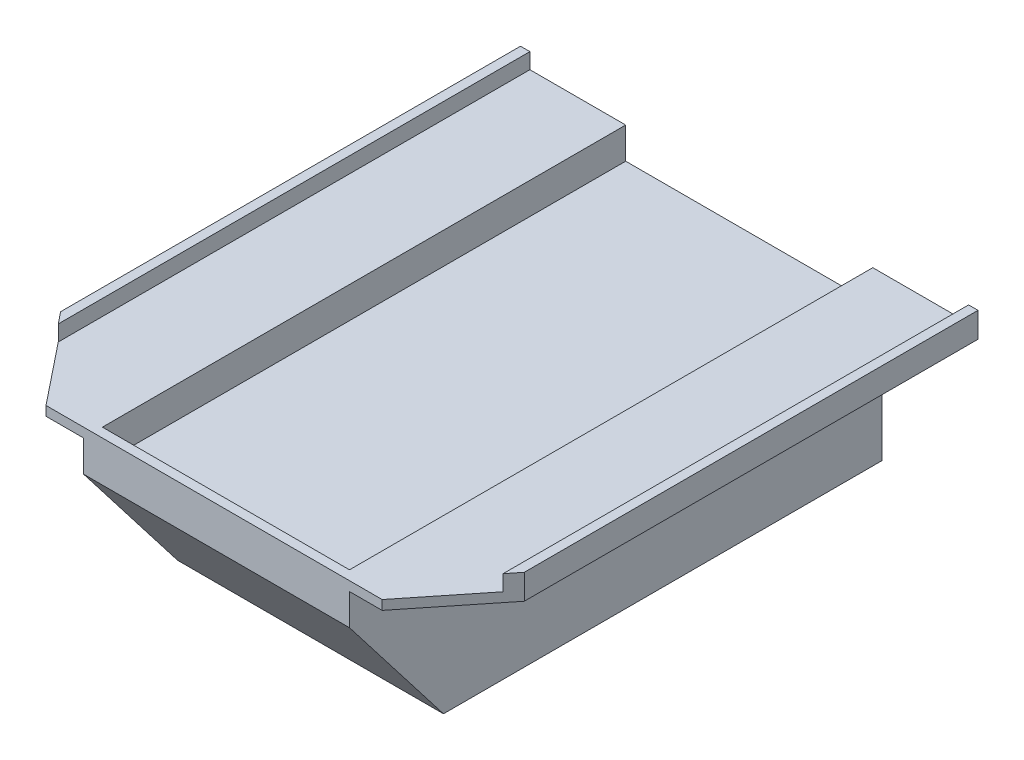
ISO-10303-21;
HEADER;
FILE_DESCRIPTION(('STEP AP214'),'2;1');
FILE_NAME('part.step','',(''),(''),'','','');
FILE_SCHEMA(('AUTOMOTIVE_DESIGN { 1 0 10303 214 1 1 1 1 }'));
ENDSEC;
DATA;
#1=APPLICATION_CONTEXT('core data for automotive mechanical design processes');
#2=APPLICATION_PROTOCOL_DEFINITION('international standard','automotive_design',2000,#1);
#3=PRODUCT_CONTEXT('',#1,'mechanical');
#4=PRODUCT('Part','Part','',(#3));
#5=PRODUCT_RELATED_PRODUCT_CATEGORY('part','',(#4));
#6=PRODUCT_DEFINITION_FORMATION('','',#4);
#7=PRODUCT_DEFINITION_CONTEXT('part definition',#1,'design');
#8=PRODUCT_DEFINITION('design','',#6,#7);
#9=PRODUCT_DEFINITION_SHAPE('','',#8);
#10=(LENGTH_UNIT() NAMED_UNIT(*) SI_UNIT(.MILLI.,.METRE.));
#11=(NAMED_UNIT(*) PLANE_ANGLE_UNIT() SI_UNIT($,.RADIAN.));
#12=(NAMED_UNIT(*) SI_UNIT($,.STERADIAN.) SOLID_ANGLE_UNIT());
#13=UNCERTAINTY_MEASURE_WITH_UNIT(LENGTH_MEASURE(1.E-05),#10,'distance_accuracy_value','');
#14=(GEOMETRIC_REPRESENTATION_CONTEXT(3) GLOBAL_UNCERTAINTY_ASSIGNED_CONTEXT((#13)) GLOBAL_UNIT_ASSIGNED_CONTEXT((#10,
#11,#12)) REPRESENTATION_CONTEXT('',''));
#15=CARTESIAN_POINT('',(0.,0.,0.));
#16=DIRECTION('',(0.,0.,1.));
#17=DIRECTION('',(1.,0.,0.));
#18=AXIS2_PLACEMENT_3D('',#15,#16,#17);
#19=CARTESIAN_POINT('',(-39.425,13.,170.));
#20=DIRECTION('',(-1.,0.,0.));
#21=DIRECTION('',(0.,0.,1.));
#22=AXIS2_PLACEMENT_3D('',#19,#20,#21);
#23=PLANE('',#22);
#24=DIRECTION('',(0.,1.,0.));
#25=VECTOR('',#24,1.);
#26=CARTESIAN_POINT('',(-39.425,13.,167.));
#27=LINE('',#26,#25);
#28=CARTESIAN_POINT('',(-39.425,2.99999999999999,167.));
#29=VERTEX_POINT('',#28);
#30=CARTESIAN_POINT('',(-39.425,13.,167.));
#31=VERTEX_POINT('',#30);
#32=EDGE_CURVE('E199',#29,#31,#27,.T.);
#33=ORIENTED_EDGE('',*,*,#32,.F.);
#34=DIRECTION('',(0.,0.,-1.));
#35=VECTOR('',#34,1.);
#36=CARTESIAN_POINT('',(-39.425,2.99999999999999,170.));
#37=LINE('',#36,#35);
#38=CARTESIAN_POINT('',(-39.425,2.99999999999999,0.));
#39=VERTEX_POINT('',#38);
#40=EDGE_CURVE('E219',#29,#39,#37,.T.);
#41=ORIENTED_EDGE('',*,*,#40,.T.);
#42=DIRECTION('',(0.,1.,0.));
#43=VECTOR('',#42,1.);
#44=CARTESIAN_POINT('',(-39.425,13.,0.));
#45=LINE('',#44,#43);
#46=CARTESIAN_POINT('',(-39.425,13.,0.));
#47=VERTEX_POINT('',#46);
#48=EDGE_CURVE('E282',#39,#47,#45,.T.);
#49=ORIENTED_EDGE('',*,*,#48,.T.);
#50=DIRECTION('',(0.,0.,-1.));
#51=VECTOR('',#50,1.);
#52=CARTESIAN_POINT('',(-39.425,13.,170.));
#53=LINE('',#52,#51);
#54=EDGE_CURVE('E252',#31,#47,#53,.T.);
#55=ORIENTED_EDGE('',*,*,#54,.F.);
#56=EDGE_LOOP('',(#33,#41,#49,#55));
#57=FACE_BOUND('',#56,.T.);
#58=ADVANCED_FACE('F33',(#57),#23,.F.);
#59=CARTESIAN_POINT('',(39.425,13.,170.));
#60=DIRECTION('',(1.,0.,0.));
#61=DIRECTION('',(0.,0.,-1.));
#62=AXIS2_PLACEMENT_3D('',#59,#60,#61);
#63=PLANE('',#62);
#64=DIRECTION('',(0.,-1.,0.));
#65=VECTOR('',#64,1.);
#66=CARTESIAN_POINT('',(39.425,13.,167.));
#67=LINE('',#66,#65);
#68=CARTESIAN_POINT('',(39.425,13.,167.));
#69=VERTEX_POINT('',#68);
#70=CARTESIAN_POINT('',(39.425,2.99999999999999,167.));
#71=VERTEX_POINT('',#70);
#72=EDGE_CURVE('E196',#69,#71,#67,.T.);
#73=ORIENTED_EDGE('',*,*,#72,.F.);
#74=DIRECTION('',(0.,0.,-1.));
#75=VECTOR('',#74,1.);
#76=CARTESIAN_POINT('',(39.425,13.,170.));
#77=LINE('',#76,#75);
#78=CARTESIAN_POINT('',(39.425,13.,0.));
#79=VERTEX_POINT('',#78);
#80=EDGE_CURVE('E207',#69,#79,#77,.T.);
#81=ORIENTED_EDGE('',*,*,#80,.T.);
#82=DIRECTION('',(0.,-1.,0.));
#83=VECTOR('',#82,1.);
#84=CARTESIAN_POINT('',(39.425,13.,0.));
#85=LINE('',#84,#83);
#86=CARTESIAN_POINT('',(39.425,2.99999999999999,0.));
#87=VERTEX_POINT('',#86);
#88=EDGE_CURVE('E334',#79,#87,#85,.T.);
#89=ORIENTED_EDGE('',*,*,#88,.T.);
#90=DIRECTION('',(0.,0.,-1.));
#91=VECTOR('',#90,1.);
#92=CARTESIAN_POINT('',(39.425,2.99999999999999,170.));
#93=LINE('',#92,#91);
#94=EDGE_CURVE('E209',#71,#87,#93,.T.);
#95=ORIENTED_EDGE('',*,*,#94,.F.);
#96=EDGE_LOOP('',(#73,#81,#89,#95));
#97=FACE_BOUND('',#96,.T.);
#98=ADVANCED_FACE('F205',(#97),#63,.F.);
#99=CARTESIAN_POINT('',(-39.425,2.99999999999999,170.));
#100=DIRECTION('',(0.,-1.,0.));
#101=DIRECTION('',(0.,0.,-1.));
#102=AXIS2_PLACEMENT_3D('',#99,#100,#101);
#103=PLANE('',#102);
#104=DIRECTION('',(-1.,0.,0.));
#105=VECTOR('',#104,1.);
#106=CARTESIAN_POINT('',(-39.425,2.99999999999999,167.));
#107=LINE('',#106,#105);
#108=EDGE_CURVE('E11',#71,#29,#107,.T.);
#109=ORIENTED_EDGE('',*,*,#108,.F.);
#110=ORIENTED_EDGE('',*,*,#94,.T.);
#111=DIRECTION('',(-1.,0.,0.));
#112=VECTOR('',#111,1.);
#113=CARTESIAN_POINT('',(-39.425,2.99999999999999,0.));
#114=LINE('',#113,#112);
#115=EDGE_CURVE('E336',#87,#39,#114,.T.);
#116=ORIENTED_EDGE('',*,*,#115,.T.);
#117=ORIENTED_EDGE('',*,*,#40,.F.);
#118=EDGE_LOOP('',(#109,#110,#116,#117));
#119=FACE_BOUND('',#118,.T.);
#120=ADVANCED_FACE('F454',(#119),#103,.F.);
#121=CARTESIAN_POINT('',(-39.425,0.,170.));
#122=DIRECTION('',(0.,1.,0.));
#123=DIRECTION('',(0.,0.,1.));
#124=AXIS2_PLACEMENT_3D('',#121,#122,#123);
#125=PLANE('',#124);
#126=DIRECTION('',(1.,0.,0.));
#127=VECTOR('',#126,1.);
#128=CARTESIAN_POINT('',(-39.425,0.,166.207838773471));
#129=LINE('',#128,#127);
#130=CARTESIAN_POINT('',(-39.425,0.,166.207838773471));
#131=VERTEX_POINT('',#130);
#132=CARTESIAN_POINT('',(39.425,0.,166.207838773471));
#133=VERTEX_POINT('',#132);
#134=EDGE_CURVE('E407',#131,#133,#129,.T.);
#135=ORIENTED_EDGE('',*,*,#134,.F.);
#136=DIRECTION('',(0.,0.,-1.));
#137=VECTOR('',#136,1.);
#138=CARTESIAN_POINT('',(-39.425,0.,170.));
#139=LINE('',#138,#137);
#140=CARTESIAN_POINT('',(-39.425,0.,0.));
#141=VERTEX_POINT('',#140);
#142=EDGE_CURVE('E236',#131,#141,#139,.T.);
#143=ORIENTED_EDGE('',*,*,#142,.T.);
#144=DIRECTION('',(1.,0.,0.));
#145=VECTOR('',#144,1.);
#146=CARTESIAN_POINT('',(-39.425,0.,0.));
#147=LINE('',#146,#145);
#148=CARTESIAN_POINT('',(39.425,0.,0.));
#149=VERTEX_POINT('',#148);
#150=EDGE_CURVE('E310',#141,#149,#147,.T.);
#151=ORIENTED_EDGE('',*,*,#150,.T.);
#152=DIRECTION('',(0.,0.,-1.));
#153=VECTOR('',#152,1.);
#154=CARTESIAN_POINT('',(39.425,0.,170.));
#155=LINE('',#154,#153);
#156=EDGE_CURVE('E234',#133,#149,#155,.T.);
#157=ORIENTED_EDGE('',*,*,#156,.F.);
#158=EDGE_LOOP('',(#135,#143,#151,#157));
#159=FACE_BOUND('',#158,.T.);
#160=ADVANCED_FACE('F434',(#159),#125,.F.);
#161=CARTESIAN_POINT('',(-70.,18.,170.));
#162=DIRECTION('',(-1.,0.,0.));
#163=DIRECTION('',(0.,0.,1.));
#164=AXIS2_PLACEMENT_3D('',#161,#162,#163);
#165=PLANE('',#164);
#166=DIRECTION('',(0.,0.,-1.));
#167=VECTOR('',#166,1.);
#168=CARTESIAN_POINT('',(-70.,18.,170.));
#169=LINE('',#168,#167);
#170=CARTESIAN_POINT('',(-70.,18.,150.507859600993));
#171=VERTEX_POINT('',#170);
#172=CARTESIAN_POINT('',(-70.,18.,0.));
#173=VERTEX_POINT('',#172);
#174=EDGE_CURVE('E248',#171,#173,#169,.T.);
#175=ORIENTED_EDGE('',*,*,#174,.F.);
#176=DIRECTION('',(0.,-1.,0.));
#177=VECTOR('',#176,1.);
#178=CARTESIAN_POINT('',(-70.,18.,150.507859600993));
#179=LINE('',#178,#177);
#180=CARTESIAN_POINT('',(-70.,13.,150.507859600993));
#181=VERTEX_POINT('',#180);
#182=EDGE_CURVE('E389',#171,#181,#179,.T.);
#183=ORIENTED_EDGE('',*,*,#182,.T.);
#184=DIRECTION('',(0.,0.,-1.));
#185=VECTOR('',#184,1.);
#186=CARTESIAN_POINT('',(-70.,13.,170.));
#187=LINE('',#186,#185);
#188=CARTESIAN_POINT('',(-70.,13.,0.));
#189=VERTEX_POINT('',#188);
#190=EDGE_CURVE('E250',#181,#189,#187,.T.);
#191=ORIENTED_EDGE('',*,*,#190,.T.);
#192=DIRECTION('',(0.,1.,0.));
#193=VECTOR('',#192,1.);
#194=CARTESIAN_POINT('',(-70.,18.,0.));
#195=LINE('',#194,#193);
#196=EDGE_CURVE('E289',#189,#173,#195,.T.);
#197=ORIENTED_EDGE('',*,*,#196,.T.);
#198=EDGE_LOOP('',(#175,#183,#191,#197));
#199=FACE_BOUND('',#198,.T.);
#200=ADVANCED_FACE('F462',(#199),#165,.F.);
#201=CARTESIAN_POINT('',(-73.,18.,170.));
#202=DIRECTION('',(0.,-1.,0.));
#203=DIRECTION('',(0.,0.,-1.));
#204=AXIS2_PLACEMENT_3D('',#201,#202,#203);
#205=PLANE('',#204);
#206=DIRECTION('',(0.,0.,-1.));
#207=VECTOR('',#206,1.);
#208=CARTESIAN_POINT('',(-73.,18.,170.));
#209=LINE('',#208,#207);
#210=CARTESIAN_POINT('',(-73.,18.,146.75413566852));
#211=VERTEX_POINT('',#210);
#212=CARTESIAN_POINT('',(-73.,18.,0.));
#213=VERTEX_POINT('',#212);
#214=EDGE_CURVE('E246',#211,#213,#209,.T.);
#215=ORIENTED_EDGE('',*,*,#214,.F.);
#216=DIRECTION('',(-0.624316939531645,0.,-0.781171145789347));
#217=VECTOR('',#216,1.);
#218=CARTESIAN_POINT('',(-54.4217576334917,18.,170.));
#219=LINE('',#218,#217);
#220=EDGE_CURVE('E270',#171,#211,#219,.T.);
#221=ORIENTED_EDGE('',*,*,#220,.F.);
#222=ORIENTED_EDGE('',*,*,#174,.T.);
#223=DIRECTION('',(-1.,0.,0.));
#224=VECTOR('',#223,1.);
#225=CARTESIAN_POINT('',(-73.,18.,0.));
#226=LINE('',#225,#224);
#227=EDGE_CURVE('E292',#173,#213,#226,.T.);
#228=ORIENTED_EDGE('',*,*,#227,.T.);
#229=EDGE_LOOP('',(#215,#221,#222,#228));
#230=FACE_BOUND('',#229,.T.);
#231=ADVANCED_FACE('F467',(#230),#205,.F.);
#232=CARTESIAN_POINT('',(-73.,9.99999999999999,170.));
#233=DIRECTION('',(1.,0.,0.));
#234=DIRECTION('',(0.,1.,0.));
#235=AXIS2_PLACEMENT_3D('',#232,#233,#234);
#236=PLANE('',#235);
#237=DIRECTION('',(0.,0.,-1.));
#238=VECTOR('',#237,1.);
#239=CARTESIAN_POINT('',(-73.,9.99999999999999,170.));
#240=LINE('',#239,#238);
#241=CARTESIAN_POINT('',(-73.,9.99999999999999,146.75413566852));
#242=VERTEX_POINT('',#241);
#243=CARTESIAN_POINT('',(-73.,9.99999999999999,0.));
#244=VERTEX_POINT('',#243);
#245=EDGE_CURVE('E244',#242,#244,#240,.T.);
#246=ORIENTED_EDGE('',*,*,#245,.F.);
#247=DIRECTION('',(0.,1.,0.));
#248=VECTOR('',#247,1.);
#249=CARTESIAN_POINT('',(-73.,-38.8,146.75413566852));
#250=LINE('',#249,#248);
#251=EDGE_CURVE('E385',#242,#211,#250,.T.);
#252=ORIENTED_EDGE('',*,*,#251,.T.);
#253=ORIENTED_EDGE('',*,*,#214,.T.);
#254=DIRECTION('',(0.,-1.,0.));
#255=VECTOR('',#254,1.);
#256=CARTESIAN_POINT('',(-73.,9.99999999999999,0.));
#257=LINE('',#256,#255);
#258=EDGE_CURVE('E295',#213,#244,#257,.T.);
#259=ORIENTED_EDGE('',*,*,#258,.T.);
#260=EDGE_LOOP('',(#246,#252,#253,#259));
#261=FACE_BOUND('',#260,.T.);
#262=ADVANCED_FACE('F471',(#261),#236,.F.);
#263=CARTESIAN_POINT('',(-42.425,9.99999999999999,170.));
#264=DIRECTION('',(0.,1.,0.));
#265=DIRECTION('',(-1.,0.,0.));
#266=AXIS2_PLACEMENT_3D('',#263,#264,#265);
#267=PLANE('',#266);
#268=DIRECTION('',(1.,0.,0.));
#269=VECTOR('',#268,1.);
#270=CARTESIAN_POINT('',(-42.425,9.99999999999999,170.));
#271=LINE('',#270,#269);
#272=CARTESIAN_POINT('',(-54.4217576334917,9.99999999999999,170.));
#273=VERTEX_POINT('',#272);
#274=CARTESIAN_POINT('',(-42.425,9.99999999999999,170.));
#275=VERTEX_POINT('',#274);
#276=EDGE_CURVE('E342',#273,#275,#271,.T.);
#277=ORIENTED_EDGE('',*,*,#276,.F.);
#278=DIRECTION('',(-0.624316939531645,0.,-0.781171145789347));
#279=VECTOR('',#278,1.);
#280=CARTESIAN_POINT('',(-49.7457617241724,9.99999999999999,175.850799250985));
#281=LINE('',#280,#279);
#282=EDGE_CURVE('E55',#273,#242,#281,.T.);
#283=ORIENTED_EDGE('',*,*,#282,.T.);
#284=ORIENTED_EDGE('',*,*,#245,.T.);
#285=DIRECTION('',(1.,0.,0.));
#286=VECTOR('',#285,1.);
#287=CARTESIAN_POINT('',(-42.425,9.99999999999999,0.));
#288=LINE('',#287,#286);
#289=CARTESIAN_POINT('',(-42.425,9.99999999999999,0.));
#290=VERTEX_POINT('',#289);
#291=EDGE_CURVE('E298',#244,#290,#288,.T.);
#292=ORIENTED_EDGE('',*,*,#291,.T.);
#293=DIRECTION('',(0.,0.,-1.));
#294=VECTOR('',#293,1.);
#295=CARTESIAN_POINT('',(-42.425,9.99999999999999,170.));
#296=LINE('',#295,#294);
#297=EDGE_CURVE('E242',#275,#290,#296,.T.);
#298=ORIENTED_EDGE('',*,*,#297,.F.);
#299=EDGE_LOOP('',(#277,#283,#284,#292,#298));
#300=FACE_BOUND('',#299,.T.);
#301=ADVANCED_FACE('F475',(#300),#267,.F.);
#302=CARTESIAN_POINT('',(-42.425,9.99999999999999,170.));
#303=DIRECTION('',(1.,0.,0.));
#304=DIRECTION('',(0.,1.,0.));
#305=AXIS2_PLACEMENT_3D('',#302,#303,#304);
#306=PLANE('',#305);
#307=DIRECTION('',(0.,0.791105604638577,0.611679591215394));
#308=VECTOR('',#307,1.);
#309=CARTESIAN_POINT('',(-42.425,6.25848077690568,174.839031528535));
#310=LINE('',#309,#308);
#311=CARTESIAN_POINT('',(-42.425,-38.8,140.));
#312=VERTEX_POINT('',#311);
#313=CARTESIAN_POINT('',(-42.425,0.,170.));
#314=VERTEX_POINT('',#313);
#315=EDGE_CURVE('E286',#312,#314,#310,.T.);
#316=ORIENTED_EDGE('',*,*,#315,.T.);
#317=DIRECTION('',(0.,-1.,0.));
#318=VECTOR('',#317,1.);
#319=CARTESIAN_POINT('',(-42.425,9.99999999999999,170.));
#320=LINE('',#319,#318);
#321=EDGE_CURVE('E344',#275,#314,#320,.T.);
#322=ORIENTED_EDGE('',*,*,#321,.F.);
#323=ORIENTED_EDGE('',*,*,#297,.T.);
#324=DIRECTION('',(0.,-1.,0.));
#325=VECTOR('',#324,1.);
#326=CARTESIAN_POINT('',(-42.425,9.99999999999999,0.));
#327=LINE('',#326,#325);
#328=CARTESIAN_POINT('',(-42.425,-38.8,0.));
#329=VERTEX_POINT('',#328);
#330=EDGE_CURVE('E301',#290,#329,#327,.T.);
#331=ORIENTED_EDGE('',*,*,#330,.T.);
#332=DIRECTION('',(0.,0.,-1.));
#333=VECTOR('',#332,1.);
#334=CARTESIAN_POINT('',(-42.425,-38.8,170.));
#335=LINE('',#334,#333);
#336=EDGE_CURVE('E240',#312,#329,#335,.T.);
#337=ORIENTED_EDGE('',*,*,#336,.F.);
#338=EDGE_LOOP('',(#316,#322,#323,#331,#337));
#339=FACE_BOUND('',#338,.T.);
#340=ADVANCED_FACE('F479',(#339),#306,.F.);
#341=CARTESIAN_POINT('',(-42.425,-38.8,170.));
#342=DIRECTION('',(0.,1.,0.));
#343=DIRECTION('',(0.,0.,1.));
#344=AXIS2_PLACEMENT_3D('',#341,#342,#343);
#345=PLANE('',#344);
#346=DIRECTION('',(0.,0.,-1.));
#347=VECTOR('',#346,1.);
#348=CARTESIAN_POINT('',(-39.425,-38.8,170.));
#349=LINE('',#348,#347);
#350=CARTESIAN_POINT('',(-39.425,-38.8,140.));
#351=VERTEX_POINT('',#350);
#352=CARTESIAN_POINT('',(-39.425,-38.8,0.));
#353=VERTEX_POINT('',#352);
#354=EDGE_CURVE('E238',#351,#353,#349,.T.);
#355=ORIENTED_EDGE('',*,*,#354,.F.);
#356=DIRECTION('',(1.,0.,0.));
#357=VECTOR('',#356,1.);
#358=CARTESIAN_POINT('',(-73.,-38.8,140.));
#359=LINE('',#358,#357);
#360=EDGE_CURVE('E362',#312,#351,#359,.T.);
#361=ORIENTED_EDGE('',*,*,#360,.F.);
#362=ORIENTED_EDGE('',*,*,#336,.T.);
#363=DIRECTION('',(1.,0.,0.));
#364=VECTOR('',#363,1.);
#365=CARTESIAN_POINT('',(-42.425,-38.8,0.));
#366=LINE('',#365,#364);
#367=EDGE_CURVE('E304',#329,#353,#366,.T.);
#368=ORIENTED_EDGE('',*,*,#367,.T.);
#369=EDGE_LOOP('',(#355,#361,#362,#368));
#370=FACE_BOUND('',#369,.T.);
#371=ADVANCED_FACE('F416',(#370),#345,.F.);
#372=CARTESIAN_POINT('',(-39.425,-38.8,170.));
#373=DIRECTION('',(-1.,0.,0.));
#374=DIRECTION('',(0.,0.,1.));
#375=AXIS2_PLACEMENT_3D('',#372,#373,#374);
#376=PLANE('',#375);
#377=DIRECTION('',(0.,-0.791105604638577,-0.611679591215394));
#378=VECTOR('',#377,1.);
#379=CARTESIAN_POINT('',(-39.425,1.8350387736462,167.626683186084));
#380=LINE('',#379,#378);
#381=CARTESIAN_POINT('',(-39.425,-36.9649612263538,137.626683186084));
#382=VERTEX_POINT('',#381);
#383=EDGE_CURVE('E395',#131,#382,#380,.T.);
#384=ORIENTED_EDGE('',*,*,#383,.T.);
#385=DIRECTION('',(0.,-0.611679591215394,0.791105604638577));
#386=VECTOR('',#385,1.);
#387=CARTESIAN_POINT('',(-39.425,-36.9649612263538,137.626683186084));
#388=LINE('',#387,#386);
#389=EDGE_CURVE('E402',#382,#351,#388,.T.);
#390=ORIENTED_EDGE('',*,*,#389,.T.);
#391=ORIENTED_EDGE('',*,*,#354,.T.);
#392=DIRECTION('',(0.,1.,0.));
#393=VECTOR('',#392,1.);
#394=CARTESIAN_POINT('',(-39.425,-38.8,0.));
#395=LINE('',#394,#393);
#396=EDGE_CURVE('E307',#353,#141,#395,.T.);
#397=ORIENTED_EDGE('',*,*,#396,.T.);
#398=ORIENTED_EDGE('',*,*,#142,.F.);
#399=EDGE_LOOP('',(#384,#390,#391,#397,#398));
#400=FACE_BOUND('',#399,.T.);
#401=ADVANCED_FACE('F435',(#400),#376,.F.);
#402=CARTESIAN_POINT('',(39.425,-38.8,170.));
#403=DIRECTION('',(1.,0.,0.));
#404=DIRECTION('',(0.,0.,-1.));
#405=AXIS2_PLACEMENT_3D('',#402,#403,#404);
#406=PLANE('',#405);
#407=DIRECTION('',(0.,0.,-1.));
#408=VECTOR('',#407,1.);
#409=CARTESIAN_POINT('',(39.425,-38.8,170.));
#410=LINE('',#409,#408);
#411=CARTESIAN_POINT('',(39.425,-38.8,140.));
#412=VERTEX_POINT('',#411);
#413=CARTESIAN_POINT('',(39.425,-38.8,0.));
#414=VERTEX_POINT('',#413);
#415=EDGE_CURVE('E232',#412,#414,#410,.T.);
#416=ORIENTED_EDGE('',*,*,#415,.F.);
#417=DIRECTION('',(0.,-0.611679591215394,0.791105604638577));
#418=VECTOR('',#417,1.);
#419=CARTESIAN_POINT('',(39.425,-36.9649612263538,137.626683186084));
#420=LINE('',#419,#418);
#421=CARTESIAN_POINT('',(39.425,-36.9649612263538,137.626683186084));
#422=VERTEX_POINT('',#421);
#423=EDGE_CURVE('E404',#422,#412,#420,.T.);
#424=ORIENTED_EDGE('',*,*,#423,.F.);
#425=DIRECTION('',(0.,0.791105604638577,0.611679591215394));
#426=VECTOR('',#425,1.);
#427=CARTESIAN_POINT('',(39.425,1.8350387736462,167.626683186084));
#428=LINE('',#427,#426);
#429=EDGE_CURVE('E400',#422,#133,#428,.T.);
#430=ORIENTED_EDGE('',*,*,#429,.T.);
#431=ORIENTED_EDGE('',*,*,#156,.T.);
#432=DIRECTION('',(0.,-1.,0.));
#433=VECTOR('',#432,1.);
#434=CARTESIAN_POINT('',(39.425,-38.8,0.));
#435=LINE('',#434,#433);
#436=EDGE_CURVE('E313',#149,#414,#435,.T.);
#437=ORIENTED_EDGE('',*,*,#436,.T.);
#438=EDGE_LOOP('',(#416,#424,#430,#431,#437));
#439=FACE_BOUND('',#438,.T.);
#440=ADVANCED_FACE('F427',(#439),#406,.F.);
#441=CARTESIAN_POINT('',(42.425,-38.8,170.));
#442=DIRECTION('',(0.,1.,0.));
#443=DIRECTION('',(0.,0.,1.));
#444=AXIS2_PLACEMENT_3D('',#441,#442,#443);
#445=PLANE('',#444);
#446=DIRECTION('',(0.,0.,-1.));
#447=VECTOR('',#446,1.);
#448=CARTESIAN_POINT('',(42.425,-38.8,170.));
#449=LINE('',#448,#447);
#450=CARTESIAN_POINT('',(42.425,-38.8,140.));
#451=VERTEX_POINT('',#450);
#452=CARTESIAN_POINT('',(42.425,-38.8,0.));
#453=VERTEX_POINT('',#452);
#454=EDGE_CURVE('E230',#451,#453,#449,.T.);
#455=ORIENTED_EDGE('',*,*,#454,.F.);
#456=EDGE_CURVE('E359',#412,#451,#359,.T.);
#457=ORIENTED_EDGE('',*,*,#456,.F.);
#458=ORIENTED_EDGE('',*,*,#415,.T.);
#459=DIRECTION('',(1.,0.,0.));
#460=VECTOR('',#459,1.);
#461=CARTESIAN_POINT('',(42.425,-38.8,0.));
#462=LINE('',#461,#460);
#463=EDGE_CURVE('E316',#414,#453,#462,.T.);
#464=ORIENTED_EDGE('',*,*,#463,.T.);
#465=EDGE_LOOP('',(#455,#457,#458,#464));
#466=FACE_BOUND('',#465,.T.);
#467=ADVANCED_FACE('F440',(#466),#445,.F.);
#468=CARTESIAN_POINT('',(42.425,9.99999999999999,170.));
#469=DIRECTION('',(-1.,0.,0.));
#470=DIRECTION('',(0.,-1.,0.));
#471=AXIS2_PLACEMENT_3D('',#468,#469,#470);
#472=PLANE('',#471);
#473=DIRECTION('',(0.,1.,0.));
#474=VECTOR('',#473,1.);
#475=CARTESIAN_POINT('',(42.425,9.99999999999999,170.));
#476=LINE('',#475,#474);
#477=CARTESIAN_POINT('',(42.425,0.,170.));
#478=VERTEX_POINT('',#477);
#479=CARTESIAN_POINT('',(42.425,9.99999999999999,170.));
#480=VERTEX_POINT('',#479);
#481=EDGE_CURVE('E275',#478,#480,#476,.T.);
#482=ORIENTED_EDGE('',*,*,#481,.F.);
#483=DIRECTION('',(0.,-0.791105604638577,-0.611679591215394));
#484=VECTOR('',#483,1.);
#485=CARTESIAN_POINT('',(42.425,6.25848077690568,174.839031528535));
#486=LINE('',#485,#484);
#487=EDGE_CURVE('E355',#478,#451,#486,.T.);
#488=ORIENTED_EDGE('',*,*,#487,.T.);
#489=ORIENTED_EDGE('',*,*,#454,.T.);
#490=DIRECTION('',(0.,1.,0.));
#491=VECTOR('',#490,1.);
#492=CARTESIAN_POINT('',(42.425,9.99999999999999,0.));
#493=LINE('',#492,#491);
#494=CARTESIAN_POINT('',(42.425,9.99999999999999,0.));
#495=VERTEX_POINT('',#494);
#496=EDGE_CURVE('E319',#453,#495,#493,.T.);
#497=ORIENTED_EDGE('',*,*,#496,.T.);
#498=DIRECTION('',(0.,0.,-1.));
#499=VECTOR('',#498,1.);
#500=CARTESIAN_POINT('',(42.425,9.99999999999999,170.));
#501=LINE('',#500,#499);
#502=EDGE_CURVE('E228',#480,#495,#501,.T.);
#503=ORIENTED_EDGE('',*,*,#502,.F.);
#504=EDGE_LOOP('',(#482,#488,#489,#497,#503));
#505=FACE_BOUND('',#504,.T.);
#506=ADVANCED_FACE('F363',(#505),#472,.F.);
#507=CARTESIAN_POINT('',(42.425,9.99999999999999,170.));
#508=DIRECTION('',(0.,1.,0.));
#509=DIRECTION('',(-1.,0.,0.));
#510=AXIS2_PLACEMENT_3D('',#507,#508,#509);
#511=PLANE('',#510);
#512=DIRECTION('',(0.,0.,-1.));
#513=VECTOR('',#512,1.);
#514=CARTESIAN_POINT('',(73.,9.99999999999999,170.));
#515=LINE('',#514,#513);
#516=CARTESIAN_POINT('',(73.,9.99999999999999,144.8));
#517=VERTEX_POINT('',#516);
#518=CARTESIAN_POINT('',(73.,9.99999999999999,0.));
#519=VERTEX_POINT('',#518);
#520=EDGE_CURVE('E226',#517,#519,#515,.T.);
#521=ORIENTED_EDGE('',*,*,#520,.F.);
#522=DIRECTION('',(-0.624316939531645,0.,0.781171145789347));
#523=VECTOR('',#522,1.);
#524=CARTESIAN_POINT('',(48.7927329263094,9.99999999999999,175.089132584757));
#525=LINE('',#524,#523);
#526=CARTESIAN_POINT('',(52.86,9.99999999999999,170.));
#527=VERTEX_POINT('',#526);
#528=EDGE_CURVE('E259',#517,#527,#525,.T.);
#529=ORIENTED_EDGE('',*,*,#528,.T.);
#530=DIRECTION('',(1.,0.,0.));
#531=VECTOR('',#530,1.);
#532=CARTESIAN_POINT('',(42.425,9.99999999999999,170.));
#533=LINE('',#532,#531);
#534=EDGE_CURVE('E268',#480,#527,#533,.T.);
#535=ORIENTED_EDGE('',*,*,#534,.F.);
#536=ORIENTED_EDGE('',*,*,#502,.T.);
#537=DIRECTION('',(1.,0.,0.));
#538=VECTOR('',#537,1.);
#539=CARTESIAN_POINT('',(42.425,9.99999999999999,0.));
#540=LINE('',#539,#538);
#541=EDGE_CURVE('E322',#495,#519,#540,.T.);
#542=ORIENTED_EDGE('',*,*,#541,.T.);
#543=EDGE_LOOP('',(#521,#529,#535,#536,#542));
#544=FACE_BOUND('',#543,.T.);
#545=ADVANCED_FACE('F267',(#544),#511,.F.);
#546=CARTESIAN_POINT('',(73.,9.99999999999999,170.));
#547=DIRECTION('',(-1.,0.,0.));
#548=DIRECTION('',(0.,-1.,0.));
#549=AXIS2_PLACEMENT_3D('',#546,#547,#548);
#550=PLANE('',#549);
#551=DIRECTION('',(0.,0.,-1.));
#552=VECTOR('',#551,1.);
#553=CARTESIAN_POINT('',(73.,18.,170.));
#554=LINE('',#553,#552);
#555=CARTESIAN_POINT('',(73.,18.,144.8));
#556=VERTEX_POINT('',#555);
#557=CARTESIAN_POINT('',(73.,18.,0.));
#558=VERTEX_POINT('',#557);
#559=EDGE_CURVE('E224',#556,#558,#554,.T.);
#560=ORIENTED_EDGE('',*,*,#559,.F.);
#561=DIRECTION('',(0.,1.,0.));
#562=VECTOR('',#561,1.);
#563=CARTESIAN_POINT('',(73.,-38.8,144.8));
#564=LINE('',#563,#562);
#565=EDGE_CURVE('E374',#517,#556,#564,.T.);
#566=ORIENTED_EDGE('',*,*,#565,.F.);
#567=ORIENTED_EDGE('',*,*,#520,.T.);
#568=DIRECTION('',(0.,1.,0.));
#569=VECTOR('',#568,1.);
#570=CARTESIAN_POINT('',(73.,9.99999999999999,0.));
#571=LINE('',#570,#569);
#572=EDGE_CURVE('E324',#519,#558,#571,.T.);
#573=ORIENTED_EDGE('',*,*,#572,.T.);
#574=EDGE_LOOP('',(#560,#566,#567,#573));
#575=FACE_BOUND('',#574,.T.);
#576=ADVANCED_FACE('F373',(#575),#550,.F.);
#577=CARTESIAN_POINT('',(73.,18.,170.));
#578=DIRECTION('',(0.,-1.,0.));
#579=DIRECTION('',(0.,0.,-1.));
#580=AXIS2_PLACEMENT_3D('',#577,#578,#579);
#581=PLANE('',#580);
#582=DIRECTION('',(0.,0.,-1.));
#583=VECTOR('',#582,1.);
#584=CARTESIAN_POINT('',(70.,18.,170.));
#585=LINE('',#584,#583);
#586=CARTESIAN_POINT('',(70.,18.,148.553723932473));
#587=VERTEX_POINT('',#586);
#588=CARTESIAN_POINT('',(70.,18.,0.));
#589=VERTEX_POINT('',#588);
#590=EDGE_CURVE('E217',#587,#589,#585,.T.);
#591=ORIENTED_EDGE('',*,*,#590,.F.);
#592=DIRECTION('',(-0.624316939531645,0.,0.781171145789347));
#593=VECTOR('',#592,1.);
#594=CARTESIAN_POINT('',(73.,18.,144.8));
#595=LINE('',#594,#593);
#596=EDGE_CURVE('E376',#556,#587,#595,.T.);
#597=ORIENTED_EDGE('',*,*,#596,.F.);
#598=ORIENTED_EDGE('',*,*,#559,.T.);
#599=DIRECTION('',(-1.,0.,0.));
#600=VECTOR('',#599,1.);
#601=CARTESIAN_POINT('',(73.,18.,0.));
#602=LINE('',#601,#600);
#603=EDGE_CURVE('E327',#558,#589,#602,.T.);
#604=ORIENTED_EDGE('',*,*,#603,.T.);
#605=EDGE_LOOP('',(#591,#597,#598,#604));
#606=FACE_BOUND('',#605,.T.);
#607=ADVANCED_FACE('F570',(#606),#581,.F.);
#608=CARTESIAN_POINT('',(70.,18.,170.));
#609=DIRECTION('',(1.,0.,0.));
#610=DIRECTION('',(0.,0.,-1.));
#611=AXIS2_PLACEMENT_3D('',#608,#609,#610);
#612=PLANE('',#611);
#613=DIRECTION('',(0.,0.,-1.));
#614=VECTOR('',#613,1.);
#615=CARTESIAN_POINT('',(70.,13.,170.));
#616=LINE('',#615,#614);
#617=CARTESIAN_POINT('',(70.,13.,148.553723932473));
#618=VERTEX_POINT('',#617);
#619=CARTESIAN_POINT('',(70.,13.,0.));
#620=VERTEX_POINT('',#619);
#621=EDGE_CURVE('E215',#618,#620,#616,.T.);
#622=ORIENTED_EDGE('',*,*,#621,.F.);
#623=DIRECTION('',(0.,1.,0.));
#624=VECTOR('',#623,1.);
#625=CARTESIAN_POINT('',(70.,18.,148.553723932473));
#626=LINE('',#625,#624);
#627=EDGE_CURVE('E271',#618,#587,#626,.T.);
#628=ORIENTED_EDGE('',*,*,#627,.T.);
#629=ORIENTED_EDGE('',*,*,#590,.T.);
#630=DIRECTION('',(0.,-1.,0.));
#631=VECTOR('',#630,1.);
#632=CARTESIAN_POINT('',(70.,18.,0.));
#633=LINE('',#632,#631);
#634=EDGE_CURVE('E330',#589,#620,#633,.T.);
#635=ORIENTED_EDGE('',*,*,#634,.T.);
#636=EDGE_LOOP('',(#622,#628,#629,#635));
#637=FACE_BOUND('',#636,.T.);
#638=ADVANCED_FACE('F581',(#637),#612,.F.);
#639=CARTESIAN_POINT('',(70.,13.,170.));
#640=DIRECTION('',(0.,-1.,0.));
#641=DIRECTION('',(0.,0.,-1.));
#642=AXIS2_PLACEMENT_3D('',#639,#640,#641);
#643=PLANE('',#642);
#644=DIRECTION('',(-1.,0.,0.));
#645=VECTOR('',#644,1.);
#646=CARTESIAN_POINT('',(-70.,13.,170.));
#647=LINE('',#646,#645);
#648=CARTESIAN_POINT('',(52.86,13.,170.));
#649=VERTEX_POINT('',#648);
#650=CARTESIAN_POINT('',(-54.4217576334917,13.,170.));
#651=VERTEX_POINT('',#650);
#652=EDGE_CURVE('E47',#649,#651,#647,.T.);
#653=ORIENTED_EDGE('',*,*,#652,.F.);
#654=DIRECTION('',(0.624316939531645,0.,-0.781171145789347));
#655=VECTOR('',#654,1.);
#656=CARTESIAN_POINT('',(59.5406859265028,13.,161.640849784118));
#657=LINE('',#656,#655);
#658=EDGE_CURVE('E261',#649,#618,#657,.T.);
#659=ORIENTED_EDGE('',*,*,#658,.T.);
#660=ORIENTED_EDGE('',*,*,#621,.T.);
#661=DIRECTION('',(-1.,0.,0.));
#662=VECTOR('',#661,1.);
#663=CARTESIAN_POINT('',(70.,13.,0.));
#664=LINE('',#663,#662);
#665=EDGE_CURVE('E213',#620,#79,#664,.T.);
#666=ORIENTED_EDGE('',*,*,#665,.T.);
#667=ORIENTED_EDGE('',*,*,#80,.F.);
#668=DIRECTION('',(-1.,0.,0.));
#669=VECTOR('',#668,1.);
#670=CARTESIAN_POINT('',(42.425,13.,167.));
#671=LINE('',#670,#669);
#672=EDGE_CURVE('E193',#69,#31,#671,.T.);
#673=ORIENTED_EDGE('',*,*,#672,.T.);
#674=ORIENTED_EDGE('',*,*,#54,.T.);
#675=DIRECTION('',(-1.,0.,0.));
#676=VECTOR('',#675,1.);
#677=CARTESIAN_POINT('',(-70.,13.,0.));
#678=LINE('',#677,#676);
#679=EDGE_CURVE('E285',#47,#189,#678,.T.);
#680=ORIENTED_EDGE('',*,*,#679,.T.);
#681=ORIENTED_EDGE('',*,*,#190,.F.);
#682=DIRECTION('',(0.624316939531645,0.,0.781171145789347));
#683=VECTOR('',#682,1.);
#684=CARTESIAN_POINT('',(-60.4937147243658,13.,162.402516450346));
#685=LINE('',#684,#683);
#686=EDGE_CURVE('E392',#181,#651,#685,.T.);
#687=ORIENTED_EDGE('',*,*,#686,.T.);
#688=EDGE_LOOP('',(#653,#659,#660,#666,#667,#673,#674,#680,#681,#687));
#689=FACE_BOUND('',#688,.T.);
#690=ADVANCED_FACE('F211',(#689),#643,.F.);
#691=CARTESIAN_POINT('',(0.,0.,170.));
#692=DIRECTION('',(0.,0.,1.));
#693=DIRECTION('',(1.,0.,0.));
#694=AXIS2_PLACEMENT_3D('',#691,#692,#693);
#695=PLANE('',#694);
#696=DIRECTION('',(0.,-1.,0.));
#697=VECTOR('',#696,1.);
#698=CARTESIAN_POINT('',(52.86,0.,170.));
#699=LINE('',#698,#697);
#700=EDGE_CURVE('E40',#649,#527,#699,.T.);
#701=ORIENTED_EDGE('',*,*,#700,.F.);
#702=ORIENTED_EDGE('',*,*,#652,.T.);
#703=DIRECTION('',(0.,1.,0.));
#704=VECTOR('',#703,1.);
#705=CARTESIAN_POINT('',(-54.4217576334917,0.,170.));
#706=LINE('',#705,#704);
#707=EDGE_CURVE('E254',#273,#651,#706,.T.);
#708=ORIENTED_EDGE('',*,*,#707,.F.);
#709=ORIENTED_EDGE('',*,*,#276,.T.);
#710=ORIENTED_EDGE('',*,*,#321,.T.);
#711=DIRECTION('',(1.,0.,0.));
#712=VECTOR('',#711,1.);
#713=CARTESIAN_POINT('',(-39.425,0.,170.));
#714=LINE('',#713,#712);
#715=EDGE_CURVE('E278',#314,#478,#714,.T.);
#716=ORIENTED_EDGE('',*,*,#715,.T.);
#717=ORIENTED_EDGE('',*,*,#481,.T.);
#718=ORIENTED_EDGE('',*,*,#534,.T.);
#719=EDGE_LOOP('',(#701,#702,#708,#709,#710,#716,#717,#718));
#720=FACE_BOUND('',#719,.T.);
#721=ADVANCED_FACE('F273',(#720),#695,.T.);
#722=CARTESIAN_POINT('',(0.,0.,0.));
#723=DIRECTION('',(0.,0.,1.));
#724=DIRECTION('',(1.,0.,0.));
#725=AXIS2_PLACEMENT_3D('',#722,#723,#724);
#726=PLANE('',#725);
#727=ORIENTED_EDGE('',*,*,#48,.F.);
#728=ORIENTED_EDGE('',*,*,#115,.F.);
#729=ORIENTED_EDGE('',*,*,#88,.F.);
#730=ORIENTED_EDGE('',*,*,#665,.F.);
#731=ORIENTED_EDGE('',*,*,#634,.F.);
#732=ORIENTED_EDGE('',*,*,#603,.F.);
#733=ORIENTED_EDGE('',*,*,#572,.F.);
#734=ORIENTED_EDGE('',*,*,#541,.F.);
#735=ORIENTED_EDGE('',*,*,#496,.F.);
#736=ORIENTED_EDGE('',*,*,#463,.F.);
#737=ORIENTED_EDGE('',*,*,#436,.F.);
#738=ORIENTED_EDGE('',*,*,#150,.F.);
#739=ORIENTED_EDGE('',*,*,#396,.F.);
#740=ORIENTED_EDGE('',*,*,#367,.F.);
#741=ORIENTED_EDGE('',*,*,#330,.F.);
#742=ORIENTED_EDGE('',*,*,#291,.F.);
#743=ORIENTED_EDGE('',*,*,#258,.F.);
#744=ORIENTED_EDGE('',*,*,#227,.F.);
#745=ORIENTED_EDGE('',*,*,#196,.F.);
#746=ORIENTED_EDGE('',*,*,#679,.F.);
#747=EDGE_LOOP('',(#727,#728,#729,#730,#731,#732,#733,#734,#735,#736,#737,#738,#739,#740,#741,
#742,#743,#744,#745,#746));
#748=FACE_BOUND('',#747,.T.);
#749=ADVANCED_FACE('F369',(#748),#726,.F.);
#750=CARTESIAN_POINT('',(-73.,0.,170.));
#751=DIRECTION('',(0.,0.611679591215394,-0.791105604638577));
#752=DIRECTION('',(0.,0.791105604638577,0.611679591215394));
#753=AXIS2_PLACEMENT_3D('',#750,#751,#752);
#754=PLANE('',#753);
#755=ORIENTED_EDGE('',*,*,#360,.T.);
#756=DIRECTION('',(1.,0.,0.));
#757=VECTOR('',#756,1.);
#758=CARTESIAN_POINT('',(-39.425,-38.8,140.));
#759=LINE('',#758,#757);
#760=EDGE_CURVE('E394',#351,#412,#759,.T.);
#761=ORIENTED_EDGE('',*,*,#760,.T.);
#762=ORIENTED_EDGE('',*,*,#456,.T.);
#763=ORIENTED_EDGE('',*,*,#487,.F.);
#764=ORIENTED_EDGE('',*,*,#715,.F.);
#765=ORIENTED_EDGE('',*,*,#315,.F.);
#766=EDGE_LOOP('',(#755,#761,#762,#763,#764,#765));
#767=FACE_BOUND('',#766,.T.);
#768=ADVANCED_FACE('F357',(#767),#754,.F.);
#769=CARTESIAN_POINT('',(0.,-80.4284972114543,104.020856393481));
#770=DIRECTION('',(0.,-0.611679591215394,0.791105604638577));
#771=DIRECTION('',(0.,-0.791105604638577,-0.611679591215394));
#772=AXIS2_PLACEMENT_3D('',#769,#770,#771);
#773=PLANE('',#772);
#774=ORIENTED_EDGE('',*,*,#383,.F.);
#775=ORIENTED_EDGE('',*,*,#134,.T.);
#776=ORIENTED_EDGE('',*,*,#429,.F.);
#777=DIRECTION('',(1.,0.,0.));
#778=VECTOR('',#777,1.);
#779=CARTESIAN_POINT('',(-39.425,-36.9649612263538,137.626683186084));
#780=LINE('',#779,#778);
#781=EDGE_CURVE('E397',#382,#422,#780,.T.);
#782=ORIENTED_EDGE('',*,*,#781,.F.);
#783=EDGE_LOOP('',(#774,#775,#776,#782));
#784=FACE_BOUND('',#783,.T.);
#785=ADVANCED_FACE('F431',(#784),#773,.F.);
#786=CARTESIAN_POINT('',(-39.425,-36.9649612263538,137.626683186084));
#787=DIRECTION('',(0.,-0.791105604638577,-0.611679591215394));
#788=DIRECTION('',(0.,0.611679591215395,-0.791105604638577));
#789=AXIS2_PLACEMENT_3D('',#786,#787,#788);
#790=PLANE('',#789);
#791=ORIENTED_EDGE('',*,*,#760,.F.);
#792=ORIENTED_EDGE('',*,*,#389,.F.);
#793=ORIENTED_EDGE('',*,*,#781,.T.);
#794=ORIENTED_EDGE('',*,*,#423,.T.);
#795=EDGE_LOOP('',(#791,#792,#793,#794));
#796=FACE_BOUND('',#795,.T.);
#797=ADVANCED_FACE('F422',(#796),#790,.T.);
#798=CARTESIAN_POINT('',(-54.4217576334917,-38.8,170.));
#799=DIRECTION('',(0.781171145789347,0.,-0.624316939531645));
#800=DIRECTION('',(-0.624316939531645,0.,-0.781171145789347));
#801=AXIS2_PLACEMENT_3D('',#798,#799,#800);
#802=PLANE('',#801);
#803=ORIENTED_EDGE('',*,*,#182,.F.);
#804=ORIENTED_EDGE('',*,*,#220,.T.);
#805=ORIENTED_EDGE('',*,*,#251,.F.);
#806=ORIENTED_EDGE('',*,*,#282,.F.);
#807=ORIENTED_EDGE('',*,*,#707,.T.);
#808=ORIENTED_EDGE('',*,*,#686,.F.);
#809=EDGE_LOOP('',(#803,#804,#805,#806,#807,#808));
#810=FACE_BOUND('',#809,.T.);
#811=ADVANCED_FACE('F464',(#810),#802,.F.);
#812=CARTESIAN_POINT('',(73.,-38.8,144.8));
#813=DIRECTION('',(-0.781171145789347,0.,-0.624316939531645));
#814=DIRECTION('',(-0.624316939531645,0.,0.781171145789347));
#815=AXIS2_PLACEMENT_3D('',#812,#813,#814);
#816=PLANE('',#815);
#817=ORIENTED_EDGE('',*,*,#565,.T.);
#818=ORIENTED_EDGE('',*,*,#596,.T.);
#819=ORIENTED_EDGE('',*,*,#627,.F.);
#820=ORIENTED_EDGE('',*,*,#658,.F.);
#821=ORIENTED_EDGE('',*,*,#700,.T.);
#822=ORIENTED_EDGE('',*,*,#528,.F.);
#823=EDGE_LOOP('',(#817,#818,#819,#820,#821,#822));
#824=FACE_BOUND('',#823,.T.);
#825=ADVANCED_FACE('F258',(#824),#816,.F.);
#826=CARTESIAN_POINT('',(0.,0.,167.));
#827=DIRECTION('',(0.,0.,1.));
#828=DIRECTION('',(1.,0.,0.));
#829=AXIS2_PLACEMENT_3D('',#826,#827,#828);
#830=PLANE('',#829);
#831=ORIENTED_EDGE('',*,*,#108,.T.);
#832=ORIENTED_EDGE('',*,*,#32,.T.);
#833=ORIENTED_EDGE('',*,*,#672,.F.);
#834=ORIENTED_EDGE('',*,*,#72,.T.);
#835=EDGE_LOOP('',(#831,#832,#833,#834));
#836=FACE_BOUND('',#835,.T.);
#837=ADVANCED_FACE('F195',(#836),#830,.F.);
#838=CLOSED_SHELL('',(#58,#98,#120,#160,#200,#231,#262,#301,#340,#371,#401,#440,#467,#506,#545,
#576,#607,#638,#690,#721,#749,#768,#785,#797,#811,#825,#837));
#839=MANIFOLD_SOLID_BREP('B2',#838);
#840=ADVANCED_BREP_SHAPE_REPRESENTATION('',(#18,#839),#14);
#841=SHAPE_DEFINITION_REPRESENTATION(#9,#840);
ENDSEC;
END-ISO-10303-21;
